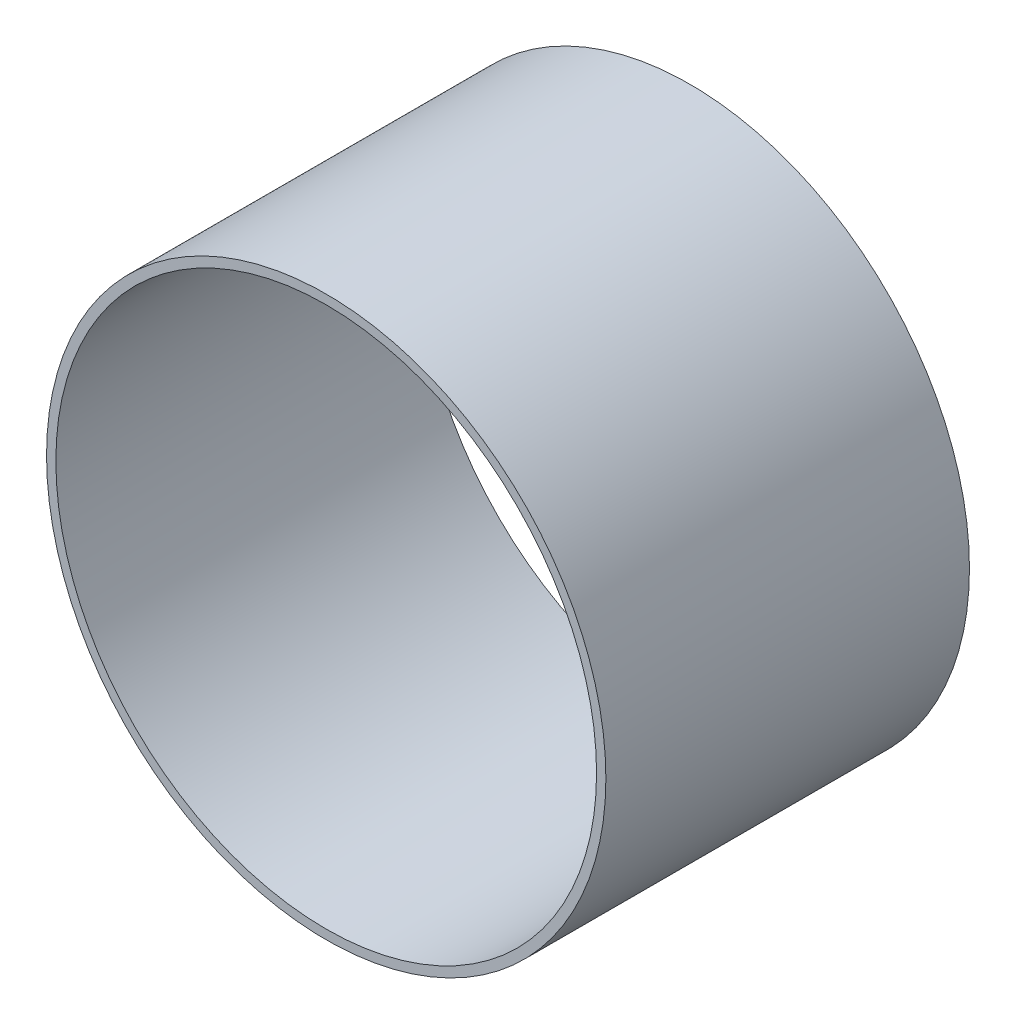
ISO-10303-21;
HEADER;
FILE_DESCRIPTION(('STEP AP214'),'2;1');
FILE_NAME('part.step','',(''),(''),'','','');
FILE_SCHEMA(('AUTOMOTIVE_DESIGN { 1 0 10303 214 1 1 1 1 }'));
ENDSEC;
DATA;
#1=APPLICATION_CONTEXT('core data for automotive mechanical design processes');
#2=APPLICATION_PROTOCOL_DEFINITION('international standard','automotive_design',2000,#1);
#3=PRODUCT_CONTEXT('',#1,'mechanical');
#4=PRODUCT('Part','Part','',(#3));
#5=PRODUCT_RELATED_PRODUCT_CATEGORY('part','',(#4));
#6=PRODUCT_DEFINITION_FORMATION('','',#4);
#7=PRODUCT_DEFINITION_CONTEXT('part definition',#1,'design');
#8=PRODUCT_DEFINITION('design','',#6,#7);
#9=PRODUCT_DEFINITION_SHAPE('','',#8);
#10=(LENGTH_UNIT() NAMED_UNIT(*) SI_UNIT(.MILLI.,.METRE.));
#11=(NAMED_UNIT(*) PLANE_ANGLE_UNIT() SI_UNIT($,.RADIAN.));
#12=(NAMED_UNIT(*) SI_UNIT($,.STERADIAN.) SOLID_ANGLE_UNIT());
#13=UNCERTAINTY_MEASURE_WITH_UNIT(LENGTH_MEASURE(1.E-05),#10,'distance_accuracy_value','');
#14=(GEOMETRIC_REPRESENTATION_CONTEXT(3) GLOBAL_UNCERTAINTY_ASSIGNED_CONTEXT((#13)) GLOBAL_UNIT_ASSIGNED_CONTEXT((#10,
#11,#12)) REPRESENTATION_CONTEXT('',''));
#15=CARTESIAN_POINT('',(0.,0.,0.));
#16=DIRECTION('',(0.,0.,1.));
#17=DIRECTION('',(1.,0.,0.));
#18=AXIS2_PLACEMENT_3D('',#15,#16,#17);
#19=CARTESIAN_POINT('',(0.,0.,117.));
#20=DIRECTION('',(0.,0.,1.));
#21=DIRECTION('',(1.,0.,0.));
#22=AXIS2_PLACEMENT_3D('',#19,#20,#21);
#23=PLANE('',#22);
#24=CARTESIAN_POINT('',(0.,0.,117.));
#25=DIRECTION('',(0.,0.,1.));
#26=DIRECTION('',(1.,0.,0.));
#27=AXIS2_PLACEMENT_3D('',#24,#25,#26);
#28=CIRCLE('',#27,90.);
#29=CARTESIAN_POINT('',(90.,0.,117.));
#30=VERTEX_POINT('',#29);
#31=EDGE_CURVE('E10',#30,#30,#28,.T.);
#32=ORIENTED_EDGE('',*,*,#31,.T.);
#33=EDGE_LOOP('',(#32));
#34=FACE_BOUND('',#33,.T.);
#35=CARTESIAN_POINT('',(0.,0.,117.));
#36=DIRECTION('',(0.,0.,1.));
#37=DIRECTION('',(1.,0.,0.));
#38=AXIS2_PLACEMENT_3D('',#35,#36,#37);
#39=CIRCLE('',#38,87.);
#40=CARTESIAN_POINT('',(87.,0.,117.));
#41=VERTEX_POINT('',#40);
#42=EDGE_CURVE('E42',#41,#41,#39,.T.);
#43=ORIENTED_EDGE('',*,*,#42,.F.);
#44=EDGE_LOOP('',(#43));
#45=FACE_BOUND('',#44,.T.);
#46=ADVANCED_FACE('F31',(#34,#45),#23,.T.);
#47=CARTESIAN_POINT('',(0.,0.,0.));
#48=DIRECTION('',(0.,0.,1.));
#49=DIRECTION('',(1.,0.,0.));
#50=AXIS2_PLACEMENT_3D('',#47,#48,#49);
#51=PLANE('',#50);
#52=CARTESIAN_POINT('',(0.,0.,0.));
#53=DIRECTION('',(0.,0.,1.));
#54=DIRECTION('',(1.,0.,0.));
#55=AXIS2_PLACEMENT_3D('',#52,#53,#54);
#56=CIRCLE('',#55,90.);
#57=CARTESIAN_POINT('',(90.,0.,0.));
#58=VERTEX_POINT('',#57);
#59=EDGE_CURVE('E35',#58,#58,#56,.T.);
#60=ORIENTED_EDGE('',*,*,#59,.F.);
#61=EDGE_LOOP('',(#60));
#62=FACE_BOUND('',#61,.T.);
#63=CARTESIAN_POINT('',(0.,0.,0.));
#64=DIRECTION('',(0.,0.,1.));
#65=DIRECTION('',(1.,0.,0.));
#66=AXIS2_PLACEMENT_3D('',#63,#64,#65);
#67=CIRCLE('',#66,87.);
#68=CARTESIAN_POINT('',(87.,0.,0.));
#69=VERTEX_POINT('',#68);
#70=EDGE_CURVE('E44',#69,#69,#67,.T.);
#71=ORIENTED_EDGE('',*,*,#70,.T.);
#72=EDGE_LOOP('',(#71));
#73=FACE_BOUND('',#72,.T.);
#74=ADVANCED_FACE('F54',(#62,#73),#51,.F.);
#75=CARTESIAN_POINT('',(0.,0.,117.));
#76=DIRECTION('',(0.,0.,-1.));
#77=DIRECTION('',(-1.,0.,0.));
#78=AXIS2_PLACEMENT_3D('',#75,#76,#77);
#79=CYLINDRICAL_SURFACE('',#78,90.);
#80=ORIENTED_EDGE('',*,*,#31,.F.);
#81=EDGE_LOOP('',(#80));
#82=FACE_BOUND('',#81,.T.);
#83=ORIENTED_EDGE('',*,*,#59,.T.);
#84=EDGE_LOOP('',(#83));
#85=FACE_BOUND('',#84,.T.);
#86=ADVANCED_FACE('F33',(#82,#85),#79,.T.);
#87=CARTESIAN_POINT('',(0.,0.,117.));
#88=DIRECTION('',(0.,0.,-1.));
#89=DIRECTION('',(-1.,0.,0.));
#90=AXIS2_PLACEMENT_3D('',#87,#88,#89);
#91=CYLINDRICAL_SURFACE('',#90,87.);
#92=ORIENTED_EDGE('',*,*,#42,.T.);
#93=EDGE_LOOP('',(#92));
#94=FACE_BOUND('',#93,.T.);
#95=ORIENTED_EDGE('',*,*,#70,.F.);
#96=EDGE_LOOP('',(#95));
#97=FACE_BOUND('',#96,.T.);
#98=ADVANCED_FACE('F50',(#94,#97),#91,.F.);
#99=CLOSED_SHELL('',(#46,#74,#86,#98));
#100=MANIFOLD_SOLID_BREP('B2',#99);
#101=ADVANCED_BREP_SHAPE_REPRESENTATION('',(#18,#100),#14);
#102=SHAPE_DEFINITION_REPRESENTATION(#9,#101);
ENDSEC;
END-ISO-10303-21;
